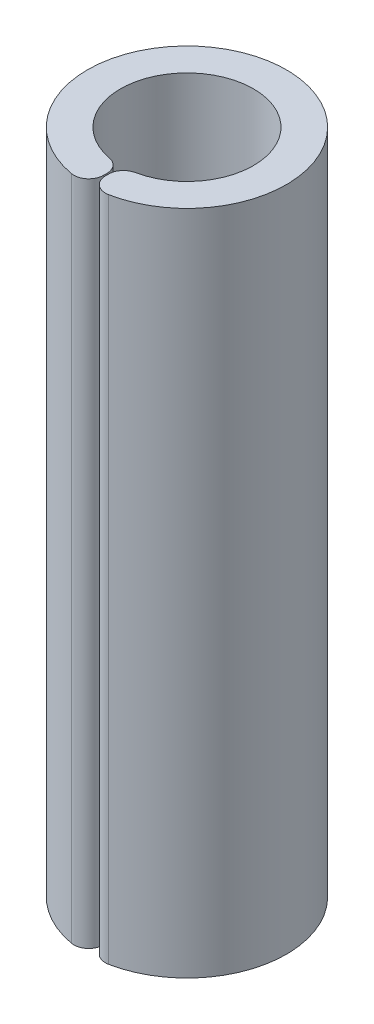
ISO-10303-21;
HEADER;
FILE_DESCRIPTION(('STEP AP214'),'2;1');
FILE_NAME('part.step','',(''),(''),'','','');
FILE_SCHEMA(('AUTOMOTIVE_DESIGN { 1 0 10303 214 1 1 1 1 }'));
ENDSEC;
DATA;
#1=APPLICATION_CONTEXT('core data for automotive mechanical design processes');
#2=APPLICATION_PROTOCOL_DEFINITION('international standard','automotive_design',2000,#1);
#3=PRODUCT_CONTEXT('',#1,'mechanical');
#4=PRODUCT('Part','Part','',(#3));
#5=PRODUCT_RELATED_PRODUCT_CATEGORY('part','',(#4));
#6=PRODUCT_DEFINITION_FORMATION('','',#4);
#7=PRODUCT_DEFINITION_CONTEXT('part definition',#1,'design');
#8=PRODUCT_DEFINITION('design','',#6,#7);
#9=PRODUCT_DEFINITION_SHAPE('','',#8);
#10=(LENGTH_UNIT() NAMED_UNIT(*) SI_UNIT(.MILLI.,.METRE.));
#11=(NAMED_UNIT(*) PLANE_ANGLE_UNIT() SI_UNIT($,.RADIAN.));
#12=(NAMED_UNIT(*) SI_UNIT($,.STERADIAN.) SOLID_ANGLE_UNIT());
#13=UNCERTAINTY_MEASURE_WITH_UNIT(LENGTH_MEASURE(1.E-05),#10,'distance_accuracy_value','');
#14=(GEOMETRIC_REPRESENTATION_CONTEXT(3) GLOBAL_UNCERTAINTY_ASSIGNED_CONTEXT((#13)) GLOBAL_UNIT_ASSIGNED_CONTEXT((#10,
#11,#12)) REPRESENTATION_CONTEXT('',''));
#15=CARTESIAN_POINT('',(0.,0.,0.));
#16=DIRECTION('',(0.,0.,1.));
#17=DIRECTION('',(1.,0.,0.));
#18=AXIS2_PLACEMENT_3D('',#15,#16,#17);
#19=CARTESIAN_POINT('',(0.,26.8,0.));
#20=DIRECTION('',(0.,-1.,0.));
#21=DIRECTION('',(0.,0.,-1.));
#22=AXIS2_PLACEMENT_3D('',#19,#20,#21);
#23=CYLINDRICAL_SURFACE('',#22,2.675);
#24=CARTESIAN_POINT('',(0.,0.,0.));
#25=DIRECTION('',(0.,-1.,0.));
#26=DIRECTION('',(0.,0.,1.));
#27=AXIS2_PLACEMENT_3D('',#24,#25,#26);
#28=CIRCLE('',#27,2.675);
#29=CARTESIAN_POINT('',(-0.490076335877832,0.,2.62972435532943));
#30=VERTEX_POINT('',#29);
#31=CARTESIAN_POINT('',(0.535896713145356,0.,2.62077082417372));
#32=VERTEX_POINT('',#31);
#33=EDGE_CURVE('E135',#30,#32,#28,.T.);
#34=ORIENTED_EDGE('',*,*,#33,.T.);
#35=DIRECTION('',(0.,-1.,0.));
#36=VECTOR('',#35,1.);
#37=CARTESIAN_POINT('',(0.535896713145356,26.8,2.62077082417367));
#38=LINE('',#37,#36);
#39=CARTESIAN_POINT('',(0.535896713145356,26.8,2.62077082417367));
#40=VERTEX_POINT('',#39);
#41=EDGE_CURVE('E11',#32,#40,#38,.F.);
#42=ORIENTED_EDGE('',*,*,#41,.T.);
#43=CARTESIAN_POINT('',(0.,26.8,0.));
#44=DIRECTION('',(0.,-1.,0.));
#45=DIRECTION('',(0.,0.,1.));
#46=AXIS2_PLACEMENT_3D('',#43,#44,#45);
#47=CIRCLE('',#46,2.675);
#48=CARTESIAN_POINT('',(-0.490076335877832,26.8,2.62972435532932));
#49=VERTEX_POINT('',#48);
#50=EDGE_CURVE('E133',#49,#40,#47,.T.);
#51=ORIENTED_EDGE('',*,*,#50,.F.);
#52=DIRECTION('',(0.,-1.,0.));
#53=VECTOR('',#52,1.);
#54=CARTESIAN_POINT('',(-0.490076335877832,26.8,2.62972435532932));
#55=LINE('',#54,#53);
#56=EDGE_CURVE('E47',#49,#30,#55,.T.);
#57=ORIENTED_EDGE('',*,*,#56,.T.);
#58=EDGE_LOOP('',(#34,#42,#51,#57));
#59=FACE_BOUND('',#58,.T.);
#60=ADVANCED_FACE('F39',(#59),#23,.F.);
#61=CARTESIAN_POINT('',(0.0466851872197305,26.8,2.67459258454333));
#62=DIRECTION('',(0.999847695156391,0.,-0.0174524064372837));
#63=DIRECTION('',(-0.0174524064372837,0.,-0.999847695156391));
#64=AXIS2_PLACEMENT_3D('',#61,#62,#63);
#65=PLANE('',#64);
#66=DIRECTION('',(0.0174524064372837,0.,0.999847695156391));
#67=VECTOR('',#66,1.);
#68=CARTESIAN_POINT('',(0.0466851872197305,0.,2.67459258454339));
#69=LINE('',#68,#67);
#70=CARTESIAN_POINT('',(0.0561892279720144,0.,3.21907871457972));
#71=VERTEX_POINT('',#70);
#72=CARTESIAN_POINT('',(0.0584069233315887,0.,3.34613039663834));
#73=VERTEX_POINT('',#72);
#74=EDGE_CURVE('E131',#71,#73,#69,.T.);
#75=ORIENTED_EDGE('',*,*,#74,.T.);
#76=DIRECTION('',(0.,-1.,0.));
#77=VECTOR('',#76,1.);
#78=CARTESIAN_POINT('',(0.0584069233315887,26.8,3.34613039663828));
#79=LINE('',#78,#77);
#80=CARTESIAN_POINT('',(0.0584069233315887,26.8,3.34613039663828));
#81=VERTEX_POINT('',#80);
#82=EDGE_CURVE('E110',#73,#81,#79,.F.);
#83=ORIENTED_EDGE('',*,*,#82,.T.);
#84=DIRECTION('',(0.0174524064372837,0.,0.999847695156391));
#85=VECTOR('',#84,1.);
#86=CARTESIAN_POINT('',(0.0466851872197305,26.8,2.67459258454333));
#87=LINE('',#86,#85);
#88=CARTESIAN_POINT('',(0.0561892279720144,26.8,3.21907871457966));
#89=VERTEX_POINT('',#88);
#90=EDGE_CURVE('E171',#89,#81,#87,.T.);
#91=ORIENTED_EDGE('',*,*,#90,.F.);
#92=DIRECTION('',(0.,-1.,0.));
#93=VECTOR('',#92,1.);
#94=CARTESIAN_POINT('',(0.0561892279720144,26.8,3.21907871457966));
#95=LINE('',#94,#93);
#96=EDGE_CURVE('E115',#89,#71,#95,.T.);
#97=ORIENTED_EDGE('',*,*,#96,.T.);
#98=EDGE_LOOP('',(#75,#83,#91,#97));
#99=FACE_BOUND('',#98,.T.);
#100=ADVANCED_FACE('F181',(#99),#65,.F.);
#101=CARTESIAN_POINT('',(0.,26.8,0.));
#102=DIRECTION('',(0.,-1.,0.));
#103=DIRECTION('',(0.,0.,-1.));
#104=AXIS2_PLACEMENT_3D('',#101,#102,#103);
#105=CYLINDRICAL_SURFACE('',#104,4.);
#106=CARTESIAN_POINT('',(0.,26.8,0.));
#107=DIRECTION('',(0.,1.,0.));
#108=DIRECTION('',(0.,0.,1.));
#109=AXIS2_PLACEMENT_3D('',#106,#107,#108);
#110=CIRCLE('',#109,4.);
#111=CARTESIAN_POINT('',(0.774488871088774,26.8,3.92430465032462));
#112=VERTEX_POINT('',#111);
#113=CARTESIAN_POINT('',(-0.705882352941223,26.8,3.93722365427801));
#114=VERTEX_POINT('',#113);
#115=EDGE_CURVE('E124',#112,#114,#110,.T.);
#116=ORIENTED_EDGE('',*,*,#115,.F.);
#117=DIRECTION('',(0.,-1.,0.));
#118=VECTOR('',#117,1.);
#119=CARTESIAN_POINT('',(0.774488871088774,26.8,3.92430465032462));
#120=LINE('',#119,#118);
#121=CARTESIAN_POINT('',(0.774488871088774,0.,3.92430465032462));
#122=VERTEX_POINT('',#121);
#123=EDGE_CURVE('E109',#112,#122,#120,.T.);
#124=ORIENTED_EDGE('',*,*,#123,.T.);
#125=CARTESIAN_POINT('',(0.,0.,0.));
#126=DIRECTION('',(0.,1.,0.));
#127=DIRECTION('',(0.,0.,1.));
#128=AXIS2_PLACEMENT_3D('',#125,#126,#127);
#129=CIRCLE('',#128,4.);
#130=CARTESIAN_POINT('',(-0.705882352941223,0.,3.93722365427801));
#131=VERTEX_POINT('',#130);
#132=EDGE_CURVE('E122',#122,#131,#129,.T.);
#133=ORIENTED_EDGE('',*,*,#132,.T.);
#134=DIRECTION('',(0.,-1.,0.));
#135=VECTOR('',#134,1.);
#136=CARTESIAN_POINT('',(-0.705882352941223,26.8,3.93722365427801));
#137=LINE('',#136,#135);
#138=EDGE_CURVE('E126',#131,#114,#137,.F.);
#139=ORIENTED_EDGE('',*,*,#138,.T.);
#140=EDGE_LOOP('',(#116,#124,#133,#139));
#141=FACE_BOUND('',#140,.T.);
#142=ADVANCED_FACE('F121',(#141),#105,.T.);
#143=CARTESIAN_POINT('',(0.,26.8,2.67499999999998));
#144=DIRECTION('',(-1.,0.,0.));
#145=DIRECTION('',(0.,0.,1.));
#146=AXIS2_PLACEMENT_3D('',#143,#144,#145);
#147=PLANE('',#146);
#148=DIRECTION('',(0.,0.,-1.));
#149=VECTOR('',#148,1.);
#150=CARTESIAN_POINT('',(0.,26.8,2.67499999999998));
#151=LINE('',#150,#149);
#152=CARTESIAN_POINT('',(1.11022302462516E-13,26.8,3.34664010613628));
#153=VERTEX_POINT('',#152);
#154=CARTESIAN_POINT('',(0.,26.8,3.21956907054344));
#155=VERTEX_POINT('',#154);
#156=EDGE_CURVE('E139',#153,#155,#151,.T.);
#157=ORIENTED_EDGE('',*,*,#156,.F.);
#158=DIRECTION('',(0.,-1.,0.));
#159=VECTOR('',#158,1.);
#160=CARTESIAN_POINT('',(1.11022302462516E-13,26.8,3.34664010613628));
#161=LINE('',#160,#159);
#162=CARTESIAN_POINT('',(0.,0.,3.34664010613628));
#163=VERTEX_POINT('',#162);
#164=EDGE_CURVE('E156',#153,#163,#161,.T.);
#165=ORIENTED_EDGE('',*,*,#164,.T.);
#166=DIRECTION('',(0.,0.,-1.));
#167=VECTOR('',#166,1.);
#168=CARTESIAN_POINT('',(0.,0.,2.67500000000004));
#169=LINE('',#168,#167);
#170=CARTESIAN_POINT('',(0.,0.,3.21956907054344));
#171=VERTEX_POINT('',#170);
#172=EDGE_CURVE('E130',#163,#171,#169,.T.);
#173=ORIENTED_EDGE('',*,*,#172,.T.);
#174=DIRECTION('',(0.,-1.,0.));
#175=VECTOR('',#174,1.);
#176=CARTESIAN_POINT('',(0.,26.8,3.21956907054344));
#177=LINE('',#176,#175);
#178=EDGE_CURVE('E54',#171,#155,#177,.F.);
#179=ORIENTED_EDGE('',*,*,#178,.T.);
#180=EDGE_LOOP('',(#157,#165,#173,#179));
#181=FACE_BOUND('',#180,.T.);
#182=ADVANCED_FACE('F185',(#181),#147,.F.);
#183=CARTESIAN_POINT('',(0.,26.8,0.));
#184=DIRECTION('',(0.,1.,0.));
#185=DIRECTION('',(0.,0.,1.));
#186=AXIS2_PLACEMENT_3D('',#183,#184,#185);
#187=PLANE('',#186);
#188=ORIENTED_EDGE('',*,*,#90,.T.);
#189=CARTESIAN_POINT('',(0.658315540425503,26.8,3.33565895277599));
#190=DIRECTION('',(0.,1.,0.));
#191=DIRECTION('',(0.,0.,1.));
#192=AXIS2_PLACEMENT_3D('',#189,#190,#191);
#193=CIRCLE('',#192,0.6);
#194=EDGE_CURVE('E153',#81,#112,#193,.T.);
#195=ORIENTED_EDGE('',*,*,#194,.T.);
#196=ORIENTED_EDGE('',*,*,#115,.T.);
#197=CARTESIAN_POINT('',(-0.599999999999934,26.8,3.34664010613628));
#198=DIRECTION('',(0.,1.,0.));
#199=DIRECTION('',(0.,0.,1.));
#200=AXIS2_PLACEMENT_3D('',#197,#198,#199);
#201=CIRCLE('',#200,0.6);
#202=EDGE_CURVE('E61',#114,#153,#201,.T.);
#203=ORIENTED_EDGE('',*,*,#202,.T.);
#204=ORIENTED_EDGE('',*,*,#156,.T.);
#205=CARTESIAN_POINT('',(-0.600000000000045,26.8,3.21956907054344));
#206=DIRECTION('',(0.,1.,0.));
#207=DIRECTION('',(0.,0.,1.));
#208=AXIS2_PLACEMENT_3D('',#205,#206,#207);
#209=CIRCLE('',#208,0.6);
#210=EDGE_CURVE('E148',#155,#49,#209,.T.);
#211=ORIENTED_EDGE('',*,*,#210,.T.);
#212=ORIENTED_EDGE('',*,*,#50,.T.);
#213=CARTESIAN_POINT('',(0.656097845065928,26.8,3.20860727071731));
#214=DIRECTION('',(0.,1.,0.));
#215=DIRECTION('',(0.,0.,1.));
#216=AXIS2_PLACEMENT_3D('',#213,#214,#215);
#217=CIRCLE('',#216,0.6);
#218=EDGE_CURVE('E150',#40,#89,#217,.T.);
#219=ORIENTED_EDGE('',*,*,#218,.T.);
#220=EDGE_LOOP('',(#188,#195,#196,#203,#204,#211,#212,#219));
#221=FACE_BOUND('',#220,.T.);
#222=ADVANCED_FACE('F175',(#221),#187,.T.);
#223=CARTESIAN_POINT('',(0.,0.,0.));
#224=DIRECTION('',(0.,1.,0.));
#225=DIRECTION('',(0.,0.,1.));
#226=AXIS2_PLACEMENT_3D('',#223,#224,#225);
#227=PLANE('',#226);
#228=ORIENTED_EDGE('',*,*,#132,.F.);
#229=CARTESIAN_POINT('',(0.658315540425503,0.,3.33565895277599));
#230=DIRECTION('',(0.,1.,0.));
#231=DIRECTION('',(0.,0.,1.));
#232=AXIS2_PLACEMENT_3D('',#229,#230,#231);
#233=CIRCLE('',#232,0.6);
#234=EDGE_CURVE('E105',#122,#73,#233,.F.);
#235=ORIENTED_EDGE('',*,*,#234,.T.);
#236=ORIENTED_EDGE('',*,*,#74,.F.);
#237=CARTESIAN_POINT('',(0.656097845065928,0.,3.20860727071731));
#238=DIRECTION('',(0.,1.,0.));
#239=DIRECTION('',(0.,0.,1.));
#240=AXIS2_PLACEMENT_3D('',#237,#238,#239);
#241=CIRCLE('',#240,0.6);
#242=EDGE_CURVE('E142',#71,#32,#241,.F.);
#243=ORIENTED_EDGE('',*,*,#242,.T.);
#244=ORIENTED_EDGE('',*,*,#33,.F.);
#245=CARTESIAN_POINT('',(-0.599999999999934,0.,3.21956907054344));
#246=DIRECTION('',(0.,1.,0.));
#247=DIRECTION('',(0.,0.,1.));
#248=AXIS2_PLACEMENT_3D('',#245,#246,#247);
#249=CIRCLE('',#248,0.6);
#250=EDGE_CURVE('E125',#30,#171,#249,.F.);
#251=ORIENTED_EDGE('',*,*,#250,.T.);
#252=ORIENTED_EDGE('',*,*,#172,.F.);
#253=CARTESIAN_POINT('',(-0.599999999999934,0.,3.34664010613628));
#254=DIRECTION('',(0.,1.,0.));
#255=DIRECTION('',(0.,0.,1.));
#256=AXIS2_PLACEMENT_3D('',#253,#254,#255);
#257=CIRCLE('',#256,0.6);
#258=EDGE_CURVE('E116',#163,#131,#257,.F.);
#259=ORIENTED_EDGE('',*,*,#258,.T.);
#260=EDGE_LOOP('',(#228,#235,#236,#243,#244,#251,#252,#259));
#261=FACE_BOUND('',#260,.T.);
#262=ADVANCED_FACE('F128',(#261),#227,.F.);
#263=CARTESIAN_POINT('',(0.658315540425503,26.8,3.33565895277599));
#264=DIRECTION('',(0.,-1.,0.));
#265=DIRECTION('',(0.,0.,-1.));
#266=AXIS2_PLACEMENT_3D('',#263,#264,#265);
#267=CYLINDRICAL_SURFACE('',#266,0.6);
#268=ORIENTED_EDGE('',*,*,#194,.F.);
#269=ORIENTED_EDGE('',*,*,#82,.F.);
#270=ORIENTED_EDGE('',*,*,#234,.F.);
#271=ORIENTED_EDGE('',*,*,#123,.F.);
#272=EDGE_LOOP('',(#268,#269,#270,#271));
#273=FACE_BOUND('',#272,.T.);
#274=ADVANCED_FACE('F108',(#273),#267,.T.);
#275=CARTESIAN_POINT('',(-0.599999999999934,26.8,3.34664010613628));
#276=DIRECTION('',(0.,-1.,0.));
#277=DIRECTION('',(0.,0.,-1.));
#278=AXIS2_PLACEMENT_3D('',#275,#276,#277);
#279=CYLINDRICAL_SURFACE('',#278,0.6);
#280=ORIENTED_EDGE('',*,*,#202,.F.);
#281=ORIENTED_EDGE('',*,*,#138,.F.);
#282=ORIENTED_EDGE('',*,*,#258,.F.);
#283=ORIENTED_EDGE('',*,*,#164,.F.);
#284=EDGE_LOOP('',(#280,#281,#282,#283));
#285=FACE_BOUND('',#284,.T.);
#286=ADVANCED_FACE('F184',(#285),#279,.T.);
#287=CARTESIAN_POINT('',(0.656097845065928,26.8,3.20860727071731));
#288=DIRECTION('',(0.,-1.,0.));
#289=DIRECTION('',(0.,0.,-1.));
#290=AXIS2_PLACEMENT_3D('',#287,#288,#289);
#291=CYLINDRICAL_SURFACE('',#290,0.6);
#292=ORIENTED_EDGE('',*,*,#218,.F.);
#293=ORIENTED_EDGE('',*,*,#41,.F.);
#294=ORIENTED_EDGE('',*,*,#242,.F.);
#295=ORIENTED_EDGE('',*,*,#96,.F.);
#296=EDGE_LOOP('',(#292,#293,#294,#295));
#297=FACE_BOUND('',#296,.T.);
#298=ADVANCED_FACE('F179',(#297),#291,.T.);
#299=CARTESIAN_POINT('',(-0.600000000000045,26.8,3.21956907054344));
#300=DIRECTION('',(0.,-1.,0.));
#301=DIRECTION('',(0.,0.,-1.));
#302=AXIS2_PLACEMENT_3D('',#299,#300,#301);
#303=CYLINDRICAL_SURFACE('',#302,0.6);
#304=ORIENTED_EDGE('',*,*,#210,.F.);
#305=ORIENTED_EDGE('',*,*,#178,.F.);
#306=ORIENTED_EDGE('',*,*,#250,.F.);
#307=ORIENTED_EDGE('',*,*,#56,.F.);
#308=EDGE_LOOP('',(#304,#305,#306,#307));
#309=FACE_BOUND('',#308,.T.);
#310=ADVANCED_FACE('F41',(#309),#303,.T.);
#311=CLOSED_SHELL('',(#60,#100,#142,#182,#222,#262,#274,#286,#298,#310));
#312=MANIFOLD_SOLID_BREP('B2',#311);
#313=ADVANCED_BREP_SHAPE_REPRESENTATION('',(#18,#312),#14);
#314=SHAPE_DEFINITION_REPRESENTATION(#9,#313);
ENDSEC;
END-ISO-10303-21;
